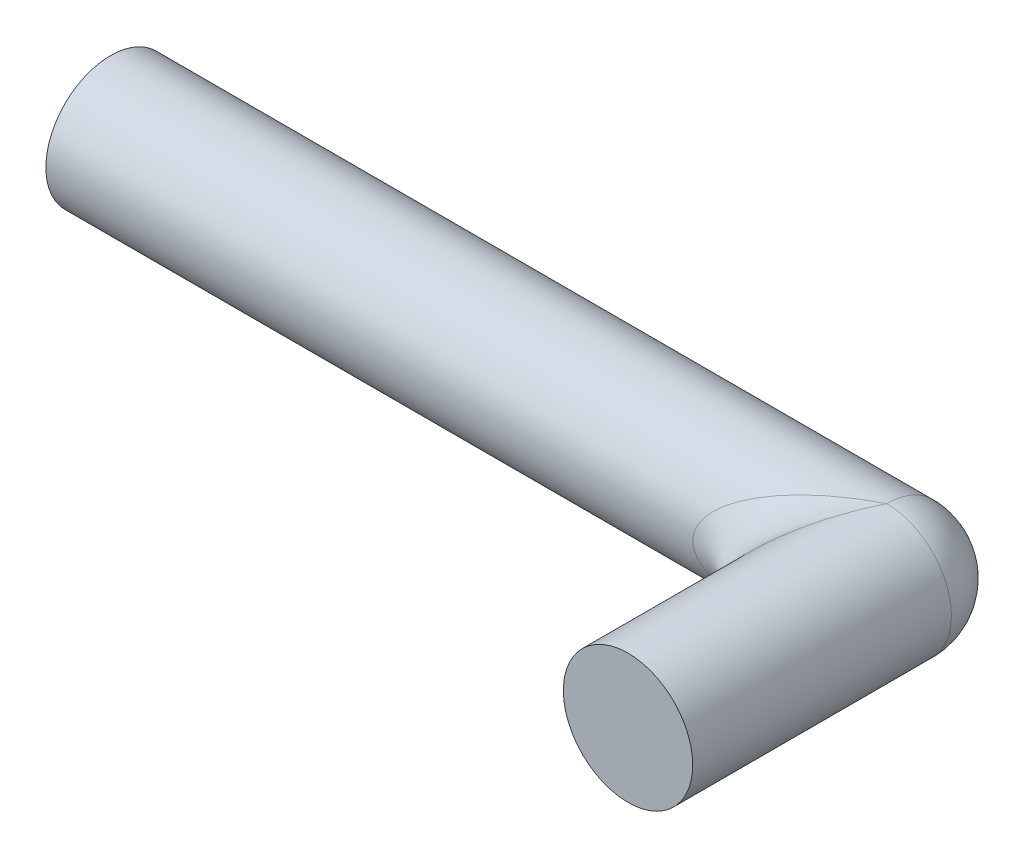
ISO-10303-21;
HEADER;
FILE_DESCRIPTION(('STEP AP214'),'2;1');
FILE_NAME('part.step','',(''),(''),'','','');
FILE_SCHEMA(('AUTOMOTIVE_DESIGN { 1 0 10303 214 1 1 1 1 }'));
ENDSEC;
DATA;
#1=APPLICATION_CONTEXT('core data for automotive mechanical design processes');
#2=APPLICATION_PROTOCOL_DEFINITION('international standard','automotive_design',2000,#1);
#3=PRODUCT_CONTEXT('',#1,'mechanical');
#4=PRODUCT('Part','Part','',(#3));
#5=PRODUCT_RELATED_PRODUCT_CATEGORY('part','',(#4));
#6=PRODUCT_DEFINITION_FORMATION('','',#4);
#7=PRODUCT_DEFINITION_CONTEXT('part definition',#1,'design');
#8=PRODUCT_DEFINITION('design','',#6,#7);
#9=PRODUCT_DEFINITION_SHAPE('','',#8);
#10=(LENGTH_UNIT() NAMED_UNIT(*) SI_UNIT(.MILLI.,.METRE.));
#11=(NAMED_UNIT(*) PLANE_ANGLE_UNIT() SI_UNIT($,.RADIAN.));
#12=(NAMED_UNIT(*) SI_UNIT($,.STERADIAN.) SOLID_ANGLE_UNIT());
#13=UNCERTAINTY_MEASURE_WITH_UNIT(LENGTH_MEASURE(1.E-05),#10,'distance_accuracy_value','');
#14=(GEOMETRIC_REPRESENTATION_CONTEXT(3) GLOBAL_UNCERTAINTY_ASSIGNED_CONTEXT((#13)) GLOBAL_UNIT_ASSIGNED_CONTEXT((#10,
#11,#12)) REPRESENTATION_CONTEXT('',''));
#15=CARTESIAN_POINT('',(0.,0.,0.));
#16=DIRECTION('',(0.,0.,1.));
#17=DIRECTION('',(1.,0.,0.));
#18=AXIS2_PLACEMENT_3D('',#15,#16,#17);
#19=CARTESIAN_POINT('',(30.,0.,9.99999999999999));
#20=DIRECTION('',(0.,0.,1.));
#21=DIRECTION('',(1.,0.,0.));
#22=AXIS2_PLACEMENT_3D('',#19,#20,#21);
#23=PLANE('',#22);
#24=CARTESIAN_POINT('',(30.,0.,9.99999999999999));
#25=DIRECTION('',(0.,0.,1.));
#26=DIRECTION('',(1.,0.,0.));
#27=AXIS2_PLACEMENT_3D('',#24,#25,#26);
#28=CIRCLE('',#27,2.5);
#29=CARTESIAN_POINT('',(32.5,0.,9.99999999999999));
#30=VERTEX_POINT('',#29);
#31=EDGE_CURVE('E82',#30,#30,#28,.T.);
#32=ORIENTED_EDGE('',*,*,#31,.T.);
#33=EDGE_LOOP('',(#32));
#34=FACE_BOUND('',#33,.T.);
#35=ADVANCED_FACE('F45',(#34),#23,.T.);
#36=CARTESIAN_POINT('',(0.,0.,0.));
#37=DIRECTION('',(1.,0.,0.));
#38=DIRECTION('',(0.,0.,-1.));
#39=AXIS2_PLACEMENT_3D('',#36,#37,#38);
#40=PLANE('',#39);
#41=CARTESIAN_POINT('',(0.,0.,0.));
#42=DIRECTION('',(1.,0.,0.));
#43=DIRECTION('',(0.,0.,-1.));
#44=AXIS2_PLACEMENT_3D('',#41,#42,#43);
#45=CIRCLE('',#44,2.5);
#46=CARTESIAN_POINT('',(0.,0.,-2.5));
#47=VERTEX_POINT('',#46);
#48=EDGE_CURVE('E76',#47,#47,#45,.T.);
#49=ORIENTED_EDGE('',*,*,#48,.F.);
#50=EDGE_LOOP('',(#49));
#51=FACE_BOUND('',#50,.T.);
#52=ADVANCED_FACE('F91',(#51),#40,.F.);
#53=CARTESIAN_POINT('',(30.,0.,-2.85));
#54=DIRECTION('',(0.,0.,1.));
#55=DIRECTION('',(1.,0.,0.));
#56=AXIS2_PLACEMENT_3D('',#53,#54,#55);
#57=CYLINDRICAL_SURFACE('',#56,2.5);
#58=CARTESIAN_POINT('',(30.,0.,0.));
#59=DIRECTION('',(-0.894427190999916,0.,-0.447213595499958));
#60=DIRECTION('',(0.447213595499958,0.,-0.894427190999916));
#61=AXIS2_PLACEMENT_3D('',#58,#59,#60);
#62=ELLIPSE('',#61,5.59016994374947,2.5);
#63=CARTESIAN_POINT('',(30.,2.5,0.));
#64=VERTEX_POINT('',#63);
#65=CARTESIAN_POINT('',(30.,-2.5,0.));
#66=VERTEX_POINT('',#65);
#67=EDGE_CURVE('E55',#64,#66,#62,.F.);
#68=ORIENTED_EDGE('',*,*,#67,.T.);
#69=CARTESIAN_POINT('',(30.,0.,0.));
#70=DIRECTION('',(0.,0.,1.));
#71=DIRECTION('',(1.,0.,0.));
#72=AXIS2_PLACEMENT_3D('',#69,#70,#71);
#73=CIRCLE('',#72,2.5);
#74=EDGE_CURVE('E11',#66,#64,#73,.T.);
#75=ORIENTED_EDGE('',*,*,#74,.T.);
#76=EDGE_LOOP('',(#68,#75));
#77=FACE_BOUND('',#76,.T.);
#78=ORIENTED_EDGE('',*,*,#31,.F.);
#79=EDGE_LOOP('',(#78));
#80=FACE_BOUND('',#79,.T.);
#81=ADVANCED_FACE('F68',(#77,#80),#57,.T.);
#82=CARTESIAN_POINT('',(0.,0.,0.));
#83=DIRECTION('',(1.,0.,0.));
#84=DIRECTION('',(0.,0.,-1.));
#85=AXIS2_PLACEMENT_3D('',#82,#83,#84);
#86=CYLINDRICAL_SURFACE('',#85,2.5);
#87=ORIENTED_EDGE('',*,*,#48,.T.);
#88=EDGE_LOOP('',(#87));
#89=FACE_BOUND('',#88,.T.);
#90=CARTESIAN_POINT('',(30.,0.,0.));
#91=DIRECTION('',(1.,0.,0.));
#92=DIRECTION('',(0.,0.,-1.));
#93=AXIS2_PLACEMENT_3D('',#90,#91,#92);
#94=CIRCLE('',#93,2.5);
#95=EDGE_CURVE('E65',#64,#66,#94,.F.);
#96=ORIENTED_EDGE('',*,*,#95,.T.);
#97=CARTESIAN_POINT('',(30.,0.,0.));
#98=DIRECTION('',(-0.447213595499958,0.,-0.894427190999916));
#99=DIRECTION('',(0.894427190999916,0.,-0.447213595499958));
#100=AXIS2_PLACEMENT_3D('',#97,#98,#99);
#101=ELLIPSE('',#100,5.59016994374948,2.5);
#102=EDGE_CURVE('E71',#66,#64,#101,.T.);
#103=ORIENTED_EDGE('',*,*,#102,.T.);
#104=EDGE_LOOP('',(#96,#103));
#105=FACE_BOUND('',#104,.T.);
#106=ADVANCED_FACE('F74',(#89,#105),#86,.T.);
#107=CARTESIAN_POINT('',(30.,2.5,0.));
#108=CARTESIAN_POINT('',(30.,2.5,0.));
#109=CARTESIAN_POINT('',(30.,2.5,0.));
#110=CARTESIAN_POINT('',(29.8910881322405,2.49995618093748,0.217823735518979));
#111=CARTESIAN_POINT('',(29.8365989732564,2.50031928780462,0.163401026743654));
#112=CARTESIAN_POINT('',(29.782176264481,2.49995618093748,0.10891186775949));
#113=CARTESIAN_POINT('',(29.7821484555229,2.49287939071146,0.435703088954144));
#114=CARTESIAN_POINT('',(29.6727494091567,2.48575581276604,0.327250590843315));
#115=CARTESIAN_POINT('',(29.5642969110459,2.49287939071146,0.217851544477072));
#116=CARTESIAN_POINT('',(29.5661425151595,2.46446618613888,0.867714969680922));
#117=CARTESIAN_POINT('',(29.3515648115125,2.42895817232198,0.648435188487498));
#118=CARTESIAN_POINT('',(29.1322850303191,2.46446618613888,0.433857484840461));
#119=CARTESIAN_POINT('',(29.4590681983966,2.44325148834774,1.08186360320685));
#120=CARTESIAN_POINT('',(29.1933028783629,2.38664200838593,0.806697121637077));
#121=CARTESIAN_POINT('',(28.9181363967931,2.44325148834774,0.540931801603426));
#122=CARTESIAN_POINT('',(29.2486164517545,2.38685461430464,1.50276709649094));
#123=CARTESIAN_POINT('',(28.8888366086342,2.27593192914347,1.11116339136579));
#124=CARTESIAN_POINT('',(28.4972329035091,2.38685461430464,0.751383548245471));
#125=CARTESIAN_POINT('',(29.1452071375919,2.35191268230561,1.70958572481614));
#126=CARTESIAN_POINT('',(28.7417168437433,2.20737636824509,1.25828315625672));
#127=CARTESIAN_POINT('',(28.2904142751839,2.35191268230561,0.854792862408069));
#128=CARTESIAN_POINT('',(28.9438863325333,2.26852489288358,2.11222733493342));
#129=CARTESIAN_POINT('',(28.4648968460878,2.04771328876034,1.53510315391218));
#130=CARTESIAN_POINT('',(27.8877726650666,2.26852489288358,1.05611366746671));
#131=CARTESIAN_POINT('',(28.8459021603834,2.22043290110707,2.30819567923327));
#132=CARTESIAN_POINT('',(28.3343107272807,1.95636408578468,1.66568927271933));
#133=CARTESIAN_POINT('',(27.6918043207667,2.22043290110707,1.15409783961664));
#134=CARTESIAN_POINT('',(28.6571504116501,2.11145652917035,2.68569917669975));
#135=CARTESIAN_POINT('',(28.0955474100095,1.75625177531175,1.90445258999049));
#136=CARTESIAN_POINT('',(27.3143008233003,2.11145652917035,1.34284958834988));
#137=CARTESIAN_POINT('',(28.5662524033222,2.05102805611723,2.86749519335565));
#138=CARTESIAN_POINT('',(27.9865362823352,1.64717617243909,2.01346371766482));
#139=CARTESIAN_POINT('',(27.1325048066444,2.05102805611723,1.43374759667783));
#140=CARTESIAN_POINT('',(28.3932898083863,1.91830870651257,3.21342038322735));
#141=CARTESIAN_POINT('',(27.7951260980265,1.41886643909962,2.20487390197347));
#142=CARTESIAN_POINT('',(26.7865796167727,1.91830870651257,1.60671019161367));
#143=CARTESIAN_POINT('',(28.3110208209359,1.84655575355526,3.37795835812818));
#144=CARTESIAN_POINT('',(27.7119755408601,1.29926972778729,2.28802445913992));
#145=CARTESIAN_POINT('',(26.6220416418718,1.84655575355526,1.68897917906409));
#146=CARTESIAN_POINT('',(28.1568017993114,1.69233472229651,3.68639640137729));
#147=CARTESIAN_POINT('',(27.5749699404535,1.05948674990404,2.42503005954654));
#148=CARTESIAN_POINT('',(26.3136035986227,1.69233472229651,1.84319820068864));
#149=CARTESIAN_POINT('',(28.08456146918,1.61045335839642,3.83087706163995));
#150=CARTESIAN_POINT('',(27.5204781780052,0.938926039640188,2.47952182199476));
#151=CARTESIAN_POINT('',(26.1691229383601,1.61045335839642,1.91543853081998));
#152=CARTESIAN_POINT('',(27.951725816672,1.43733392704006,4.09654836665605));
#153=CARTESIAN_POINT('',(27.4407983248179,0.708841809787769,2.55920167518208));
#154=CARTESIAN_POINT('',(25.9034516333439,1.43733392704006,2.04827418332803));
#155=CARTESIAN_POINT('',(27.8907530229972,1.34668185234548,4.21849395400556));
#156=CARTESIAN_POINT('',(27.415112199347,0.598985121523428,2.58488780065303));
#157=CARTESIAN_POINT('',(25.7815060459944,1.34668185234548,2.10924697700278));
#158=CARTESIAN_POINT('',(27.7815850464173,1.1575880171017,4.43682990716535));
#159=CARTESIAN_POINT('',(27.3889307358576,0.402481129946807,2.61106926414241));
#160=CARTESIAN_POINT('',(25.5631700928347,1.1575880171017,2.21841495358267));
#161=CARTESIAN_POINT('',(27.7329444771113,1.05966709536442,4.53411104577736));
#162=CARTESIAN_POINT('',(27.388078643237,0.315594370306114,2.61192135676301));
#163=CARTESIAN_POINT('',(25.4658889542226,1.05966709536442,2.26705552288868));
#164=CARTESIAN_POINT('',(27.6493368406109,0.857803816552583,4.70132631877811));
#165=CARTESIAN_POINT('',(27.4023494005316,0.174179019539387,2.59765059946838));
#166=CARTESIAN_POINT('',(25.2986736812219,0.857803816552583,2.35066315938906));
#167=CARTESIAN_POINT('',(27.6139068142336,0.754250336973847,4.77218637153273));
#168=CARTESIAN_POINT('',(27.4172338081285,0.119527128340587,2.58276619187148));
#169=CARTESIAN_POINT('',(25.2278136284673,0.754250336973847,2.38609318576637));
#170=CARTESIAN_POINT('',(27.5573264563832,0.543063809446488,4.88534708723352));
#171=CARTESIAN_POINT('',(27.4497619149934,0.0433450177006005,2.55023808500663));
#172=CARTESIAN_POINT('',(25.1146529127665,0.543063809446488,2.44267354361676));
#173=CARTESIAN_POINT('',(27.5357792992252,0.435646619349453,4.92844140154968));
#174=CARTESIAN_POINT('',(27.4672535281656,0.0217796309184912,2.53274647183445));
#175=CARTESIAN_POINT('',(25.0715585984503,0.435646619349453,2.46422070077484));
#176=CARTESIAN_POINT('',(27.5072325087681,0.218778094431008,4.98553498246387));
#177=CARTESIAN_POINT('',(27.4924121696431,0.000144293353534095,2.50758783035685));
#178=CARTESIAN_POINT('',(25.0144650175361,0.218778094431008,2.49276749123193));
#179=CARTESIAN_POINT('',(27.5,0.109389047215504,5.));
#180=CARTESIAN_POINT('',(27.5,7.23572076750445E-05,2.5));
#181=CARTESIAN_POINT('',(25.,0.109389047215504,2.5));
#182=CARTESIAN_POINT('',(27.5,-0.109389047215503,5.));
#183=CARTESIAN_POINT('',(27.5,-7.23572076750445E-05,2.5));
#184=CARTESIAN_POINT('',(25.,-0.109389047215503,2.5));
#185=CARTESIAN_POINT('',(27.5072325087681,-0.218778094431007,4.98553498246387));
#186=CARTESIAN_POINT('',(27.4924121696431,-0.000144293353533995,2.50758783035685));
#187=CARTESIAN_POINT('',(25.0144650175361,-0.218778094431007,2.49276749123193));
#188=CARTESIAN_POINT('',(27.5357792992252,-0.435646619349453,4.92844140154968));
#189=CARTESIAN_POINT('',(27.4672535281656,-0.0217796309184913,2.53274647183445));
#190=CARTESIAN_POINT('',(25.0715585984503,-0.435646619349453,2.46422070077484));
#191=CARTESIAN_POINT('',(27.5573264563832,-0.543063809446487,4.88534708723352));
#192=CARTESIAN_POINT('',(27.4497619149934,-0.0433450177006008,2.55023808500663));
#193=CARTESIAN_POINT('',(25.1146529127665,-0.543063809446487,2.44267354361676));
#194=CARTESIAN_POINT('',(27.6139068142336,-0.754250336973847,4.77218637153273));
#195=CARTESIAN_POINT('',(27.4172338081285,-0.119527128340587,2.58276619187148));
#196=CARTESIAN_POINT('',(25.2278136284673,-0.754250336973847,2.38609318576637));
#197=CARTESIAN_POINT('',(27.6493368406109,-0.857803816552582,4.70132631877811));
#198=CARTESIAN_POINT('',(27.4023494005316,-0.174179019539387,2.59765059946838));
#199=CARTESIAN_POINT('',(25.2986736812219,-0.857803816552582,2.35066315938906));
#200=CARTESIAN_POINT('',(27.7329444771113,-1.05966709536442,4.53411104577736));
#201=CARTESIAN_POINT('',(27.388078643237,-0.315594370306114,2.61192135676301));
#202=CARTESIAN_POINT('',(25.4658889542226,-1.05966709536442,2.26705552288868));
#203=CARTESIAN_POINT('',(27.7815850464173,-1.1575880171017,4.43682990716535));
#204=CARTESIAN_POINT('',(27.3889307358576,-0.402481129946806,2.61106926414241));
#205=CARTESIAN_POINT('',(25.5631700928347,-1.1575880171017,2.21841495358267));
#206=CARTESIAN_POINT('',(27.8907530229972,-1.34668185234548,4.21849395400556));
#207=CARTESIAN_POINT('',(27.415112199347,-0.598985121523428,2.58488780065303));
#208=CARTESIAN_POINT('',(25.7815060459944,-1.34668185234548,2.10924697700278));
#209=CARTESIAN_POINT('',(27.951725816672,-1.43733392704006,4.09654836665605));
#210=CARTESIAN_POINT('',(27.4407983248179,-0.708841809787768,2.55920167518208));
#211=CARTESIAN_POINT('',(25.9034516333439,-1.43733392704006,2.04827418332803));
#212=CARTESIAN_POINT('',(28.08456146918,-1.61045335839642,3.83087706163995));
#213=CARTESIAN_POINT('',(27.5204781780052,-0.938926039640186,2.47952182199476));
#214=CARTESIAN_POINT('',(26.1691229383601,-1.61045335839642,1.91543853081998));
#215=CARTESIAN_POINT('',(28.1568017993114,-1.69233472229651,3.68639640137729));
#216=CARTESIAN_POINT('',(27.5749699404535,-1.05948674990403,2.42503005954654));
#217=CARTESIAN_POINT('',(26.3136035986227,-1.69233472229651,1.84319820068864));
#218=CARTESIAN_POINT('',(28.3110208209359,-1.84655575355526,3.37795835812818));
#219=CARTESIAN_POINT('',(27.7119755408601,-1.29926972778729,2.28802445913992));
#220=CARTESIAN_POINT('',(26.6220416418718,-1.84655575355526,1.68897917906409));
#221=CARTESIAN_POINT('',(28.3932898083863,-1.91830870651257,3.21342038322735));
#222=CARTESIAN_POINT('',(27.7951260980265,-1.41886643909962,2.20487390197347));
#223=CARTESIAN_POINT('',(26.7865796167727,-1.91830870651257,1.60671019161367));
#224=CARTESIAN_POINT('',(28.5662524033222,-2.05102805611723,2.86749519335565));
#225=CARTESIAN_POINT('',(27.9865362823352,-1.64717617243909,2.01346371766482));
#226=CARTESIAN_POINT('',(27.1325048066443,-2.05102805611723,1.43374759667783));
#227=CARTESIAN_POINT('',(28.6571504116501,-2.11145652917035,2.68569917669975));
#228=CARTESIAN_POINT('',(28.0955474100095,-1.75625177531175,1.90445258999049));
#229=CARTESIAN_POINT('',(27.3143008233003,-2.11145652917035,1.34284958834988));
#230=CARTESIAN_POINT('',(28.8459021603834,-2.22043290110707,2.30819567923328));
#231=CARTESIAN_POINT('',(28.3343107272807,-1.95636408578468,1.66568927271934));
#232=CARTESIAN_POINT('',(27.6918043207667,-2.22043290110707,1.15409783961664));
#233=CARTESIAN_POINT('',(28.9438863325333,-2.26852489288358,2.11222733493342));
#234=CARTESIAN_POINT('',(28.4648968460878,-2.04771328876034,1.53510315391218));
#235=CARTESIAN_POINT('',(27.8877726650666,-2.26852489288358,1.05611366746671));
#236=CARTESIAN_POINT('',(29.1452071375919,-2.35191268230561,1.70958572481614));
#237=CARTESIAN_POINT('',(28.7417168437433,-2.20737636824509,1.25828315625672));
#238=CARTESIAN_POINT('',(28.2904142751839,-2.35191268230561,0.854792862408069));
#239=CARTESIAN_POINT('',(29.2486164517545,-2.38685461430464,1.50276709649094));
#240=CARTESIAN_POINT('',(28.8888366086342,-2.27593192914347,1.11116339136579));
#241=CARTESIAN_POINT('',(28.4972329035091,-2.38685461430464,0.751383548245471));
#242=CARTESIAN_POINT('',(29.4590681983966,-2.44325148834774,1.08186360320685));
#243=CARTESIAN_POINT('',(29.1933028783629,-2.38664200838594,0.806697121637077));
#244=CARTESIAN_POINT('',(28.9181363967931,-2.44325148834774,0.540931801603426));
#245=CARTESIAN_POINT('',(29.5661425151595,-2.46446618613888,0.867714969680921));
#246=CARTESIAN_POINT('',(29.3515648115125,-2.42895817232198,0.648435188487498));
#247=CARTESIAN_POINT('',(29.1322850303191,-2.46446618613888,0.433857484840461));
#248=CARTESIAN_POINT('',(29.7821484555229,-2.49287939071146,0.435703088954143));
#249=CARTESIAN_POINT('',(29.6727494091567,-2.48575581276604,0.327250590843315));
#250=CARTESIAN_POINT('',(29.5642969110459,-2.49287939071146,0.217851544477072));
#251=CARTESIAN_POINT('',(29.8910881322405,-2.49995618093748,0.217823735518978));
#252=CARTESIAN_POINT('',(29.8365989732564,-2.50031928780462,0.163401026743653));
#253=CARTESIAN_POINT('',(29.782176264481,-2.49995618093748,0.108911867759489));
#254=CARTESIAN_POINT('',(30.,-2.5,0.));
#255=CARTESIAN_POINT('',(30.,-2.5,0.));
#256=CARTESIAN_POINT('',(30.,-2.5,0.));
#257=(BOUNDED_SURFACE() B_SPLINE_SURFACE(3,2,((#107,#108,#109),(#110,#111,#112),(#113,#114,
#115),(#116,#117,#118),(#119,#120,#121),(#122,#123,#124),(#125,#126,#127),(#128,#129,#130),
(#131,#132,#133),(#134,#135,#136),(#137,#138,#139),(#140,#141,#142),(#143,#144,#145),(#146,#147,
#148),(#149,#150,#151),(#152,#153,#154),(#155,#156,#157),(#158,#159,#160),(#161,#162,#163),
(#164,#165,#166),(#167,#168,#169),(#170,#171,#172),(#173,#174,#175),(#176,#177,#178),(#179,#180,
#181),(#182,#183,#184),(#185,#186,#187),(#188,#189,#190),(#191,#192,#193),(#194,#195,#196),
(#197,#198,#199),(#200,#201,#202),(#203,#204,#205),(#206,#207,#208),(#209,#210,#211),(#212,#213,
#214),(#215,#216,#217),(#218,#219,#220),(#221,#222,#223),(#224,#225,#226),(#227,#228,#229),
(#230,#231,#232),(#233,#234,#235),(#236,#237,#238),(#239,#240,#241),(#242,#243,#244),(#245,#246,
#247),(#248,#249,#250),(#251,#252,#253),(#254,#255,#256)),.UNSPECIFIED.,.F.,.F.,
.F.) B_SPLINE_SURFACE_WITH_KNOTS((4,2,2,2,2,2,2,2,2,2,2,2,2,2,2,2,2,2,2,2,2,2,2,2,4),(3,3),(0.,
0.923950270683506,1.84004706351031,2.74077820658673,3.61932038391825,4.46989850632086,
5.28816016293444,6.07156213845176,6.81975172112348,7.53489816527184,8.22188739504234,
8.88824875354153,9.54367738522641,10.1991060169113,10.8654673754105,11.552456605181,
12.2676030493293,13.0157926320011,13.7991946075184,14.617456264132,15.4680343865346,
16.3465765638661,17.2473077069425,18.1634044997693,19.0873547704528),(0.,1.),
.UNSPECIFIED.) GEOMETRIC_REPRESENTATION_ITEM() RATIONAL_B_SPLINE_SURFACE(((1.,1.,1.),(1.,
1.00000566557019,1.),(1.,0.998576699090688,1.),(1.,0.992910721279765,1.),(1.,0.988697681267574,
1.),(1.,0.97761712883305,1.),(1.,0.970795325018433,1.),(1.,0.954789124900482,1.),(1.,
0.945667069465631,1.),(1.,0.92548796875733,1.),(1.,0.914501756375306,1.),(1.,0.891169998194024,
1.),(1.,0.878891956959708,1.),(1.,0.853706993048538,1.),(1.,0.84084914596985,1.),(1.,
0.815387454422431,1.),(1.,0.802798170091792,1.),(1.,0.778880732263429,1.),(1.,0.767521437046521,
1.),(1.,0.747118526989836,1.),(1.,0.738001346912332,1.),(1.,0.723039691293395,1.),(1.,
0.717105167896984,1.),(1.,0.709170186451793,1.),(1.,0.707106781186548,1.),(1.,0.707106781186548,
1.),(1.,0.709170186451793,1.),(1.,0.717105167896984,1.),(1.,0.723039691293395,1.),(1.,
0.738001346912332,1.),(1.,0.747118526989835,1.),(1.,0.767521437046521,1.),(1.,0.778880732263429,
1.),(1.,0.802798170091792,1.),(1.,0.815387454422431,1.),(1.,0.84084914596985,1.),(1.,
0.853706993048538,1.),(1.,0.878891956959708,1.),(1.,0.891169998194024,1.),(1.,0.914501756375306,
1.),(1.,0.925487968757329,1.),(1.,0.945667069465631,1.),(1.,0.954789124900482,1.),(1.,
0.970795325018433,1.),(1.,0.97761712883305,1.),(1.,0.988697681267574,1.),(1.,0.992910721279765,
1.),(1.,0.998576699090688,1.),(1.,1.00000566557019,1.),(1.,1.,1.))) REPRESENTATION_ITEM('') SURFACE());
#258=ORIENTED_EDGE('',*,*,#102,.F.);
#259=ORIENTED_EDGE('',*,*,#67,.F.);
#260=EDGE_LOOP('',(#258,#259));
#261=FACE_BOUND('',#260,.T.);
#262=ADVANCED_FACE('F78',(#261),#257,.F.);
#263=CARTESIAN_POINT('',(30.,0.,0.));
#264=DIRECTION('',(0.,0.,1.));
#265=DIRECTION('',(1.,0.,0.));
#266=AXIS2_PLACEMENT_3D('',#263,#264,#265);
#267=SPHERICAL_SURFACE('',#266,2.5);
#268=ORIENTED_EDGE('',*,*,#95,.F.);
#269=ORIENTED_EDGE('',*,*,#74,.F.);
#270=EDGE_LOOP('',(#268,#269));
#271=FACE_BOUND('',#270,.T.);
#272=ADVANCED_FACE('F47',(#271),#267,.T.);
#273=CLOSED_SHELL('',(#35,#52,#81,#106,#262,#272));
#274=MANIFOLD_SOLID_BREP('B2',#273);
#275=ADVANCED_BREP_SHAPE_REPRESENTATION('',(#18,#274),#14);
#276=SHAPE_DEFINITION_REPRESENTATION(#9,#275);
ENDSEC;
END-ISO-10303-21;
